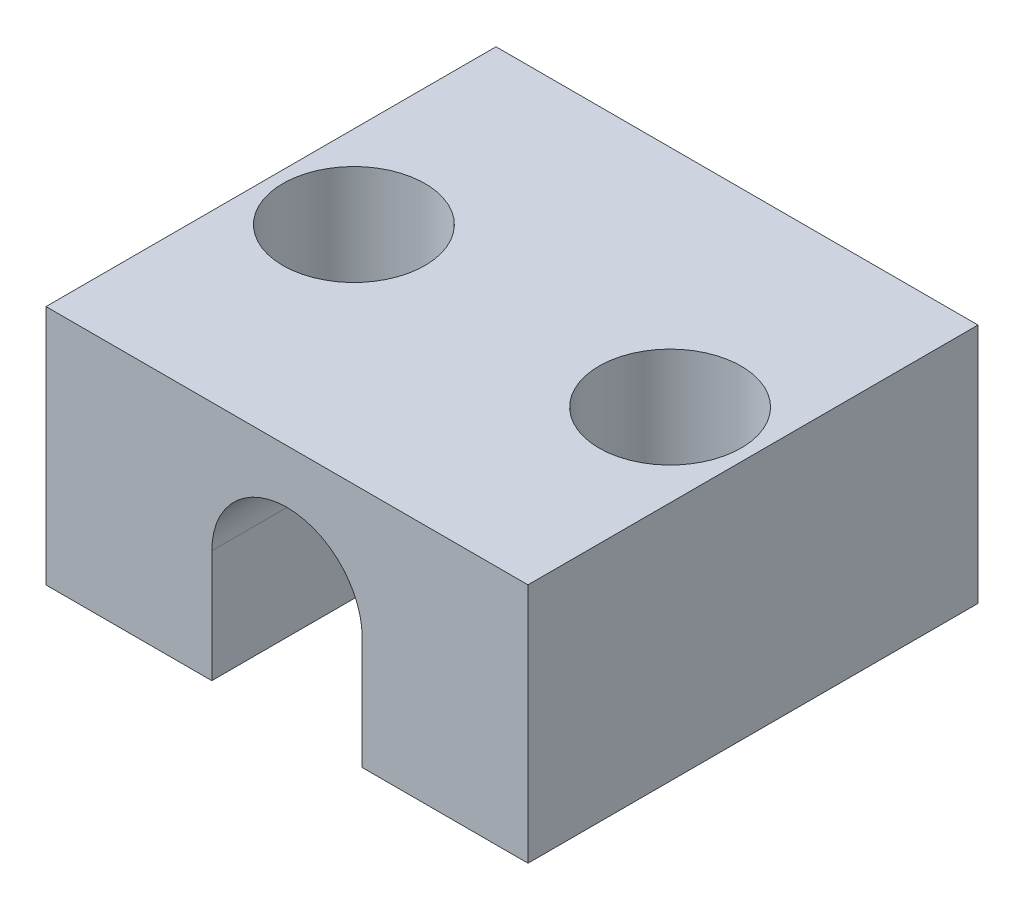
ISO-10303-21;
HEADER;
FILE_DESCRIPTION(('STEP AP214'),'2;1');
FILE_NAME('part.step','',(''),(''),'','','');
FILE_SCHEMA(('AUTOMOTIVE_DESIGN { 1 0 10303 214 1 1 1 1 }'));
ENDSEC;
DATA;
#1=APPLICATION_CONTEXT('core data for automotive mechanical design processes');
#2=APPLICATION_PROTOCOL_DEFINITION('international standard','automotive_design',2000,#1);
#3=PRODUCT_CONTEXT('',#1,'mechanical');
#4=PRODUCT('Part','Part','',(#3));
#5=PRODUCT_RELATED_PRODUCT_CATEGORY('part','',(#4));
#6=PRODUCT_DEFINITION_FORMATION('','',#4);
#7=PRODUCT_DEFINITION_CONTEXT('part definition',#1,'design');
#8=PRODUCT_DEFINITION('design','',#6,#7);
#9=PRODUCT_DEFINITION_SHAPE('','',#8);
#10=(LENGTH_UNIT() NAMED_UNIT(*) SI_UNIT(.MILLI.,.METRE.));
#11=(NAMED_UNIT(*) PLANE_ANGLE_UNIT() SI_UNIT($,.RADIAN.));
#12=(NAMED_UNIT(*) SI_UNIT($,.STERADIAN.) SOLID_ANGLE_UNIT());
#13=UNCERTAINTY_MEASURE_WITH_UNIT(LENGTH_MEASURE(1.E-05),#10,'distance_accuracy_value','');
#14=(GEOMETRIC_REPRESENTATION_CONTEXT(3) GLOBAL_UNCERTAINTY_ASSIGNED_CONTEXT((#13)) GLOBAL_UNIT_ASSIGNED_CONTEXT((#10,
#11,#12)) REPRESENTATION_CONTEXT('',''));
#15=CARTESIAN_POINT('',(0.,0.,0.));
#16=DIRECTION('',(0.,0.,1.));
#17=DIRECTION('',(1.,0.,0.));
#18=AXIS2_PLACEMENT_3D('',#15,#16,#17);
#19=CARTESIAN_POINT('',(-6.675,0.,9.5));
#20=DIRECTION('',(0.,1.,0.));
#21=DIRECTION('',(0.,0.,1.));
#22=AXIS2_PLACEMENT_3D('',#19,#20,#21);
#23=CYLINDRICAL_SURFACE('',#22,1.8);
#24=CARTESIAN_POINT('',(-6.675,0.,9.5));
#25=DIRECTION('',(0.,1.,0.));
#26=DIRECTION('',(0.,0.,1.));
#27=AXIS2_PLACEMENT_3D('',#24,#25,#26);
#28=CIRCLE('',#27,1.8);
#29=CARTESIAN_POINT('',(-6.675,0.,11.3));
#30=VERTEX_POINT('',#29);
#31=EDGE_CURVE('E149',#30,#30,#28,.T.);
#32=ORIENTED_EDGE('',*,*,#31,.F.);
#33=EDGE_LOOP('',(#32));
#34=FACE_BOUND('',#33,.T.);
#35=CARTESIAN_POINT('',(-6.675,3.,9.5));
#36=DIRECTION('',(0.,1.,0.));
#37=DIRECTION('',(0.,0.,1.));
#38=AXIS2_PLACEMENT_3D('',#35,#36,#37);
#39=CIRCLE('',#38,1.8);
#40=CARTESIAN_POINT('',(-6.675,3.,11.3));
#41=VERTEX_POINT('',#40);
#42=EDGE_CURVE('E223',#41,#41,#39,.F.);
#43=ORIENTED_EDGE('',*,*,#42,.F.);
#44=EDGE_LOOP('',(#43));
#45=FACE_BOUND('',#44,.T.);
#46=ADVANCED_FACE('F41',(#34,#45),#23,.F.);
#47=CARTESIAN_POINT('',(6.675,0.,9.5));
#48=DIRECTION('',(0.,1.,0.));
#49=DIRECTION('',(0.,0.,1.));
#50=AXIS2_PLACEMENT_3D('',#47,#48,#49);
#51=CYLINDRICAL_SURFACE('',#50,1.8);
#52=CARTESIAN_POINT('',(6.675,0.,9.5));
#53=DIRECTION('',(0.,1.,0.));
#54=DIRECTION('',(0.,0.,1.));
#55=AXIS2_PLACEMENT_3D('',#52,#53,#54);
#56=CIRCLE('',#55,1.8);
#57=CARTESIAN_POINT('',(6.675,0.,11.3));
#58=VERTEX_POINT('',#57);
#59=EDGE_CURVE('E212',#58,#58,#56,.T.);
#60=ORIENTED_EDGE('',*,*,#59,.F.);
#61=EDGE_LOOP('',(#60));
#62=FACE_BOUND('',#61,.T.);
#63=CARTESIAN_POINT('',(6.675,3.,9.5));
#64=DIRECTION('',(0.,1.,0.));
#65=DIRECTION('',(0.,0.,1.));
#66=AXIS2_PLACEMENT_3D('',#63,#64,#65);
#67=CIRCLE('',#66,1.8);
#68=CARTESIAN_POINT('',(6.675,3.,11.3));
#69=VERTEX_POINT('',#68);
#70=EDGE_CURVE('E45',#69,#69,#67,.F.);
#71=ORIENTED_EDGE('',*,*,#70,.F.);
#72=EDGE_LOOP('',(#71));
#73=FACE_BOUND('',#72,.T.);
#74=ADVANCED_FACE('F263',(#62,#73),#51,.F.);
#75=CARTESIAN_POINT('',(0.,4.75,19.));
#76=DIRECTION('',(0.,0.,-1.));
#77=DIRECTION('',(-1.,0.,0.));
#78=AXIS2_PLACEMENT_3D('',#75,#76,#77);
#79=CYLINDRICAL_SURFACE('',#78,3.175);
#80=CARTESIAN_POINT('',(0.,4.75,0.));
#81=DIRECTION('',(0.,0.,-1.));
#82=DIRECTION('',(-1.,0.,0.));
#83=AXIS2_PLACEMENT_3D('',#80,#81,#82);
#84=CIRCLE('',#83,3.175);
#85=CARTESIAN_POINT('',(-3.175,4.75,0.));
#86=VERTEX_POINT('',#85);
#87=CARTESIAN_POINT('',(3.175,4.75,0.));
#88=VERTEX_POINT('',#87);
#89=EDGE_CURVE('E144',#86,#88,#84,.T.);
#90=ORIENTED_EDGE('',*,*,#89,.T.);
#91=DIRECTION('',(0.,0.,-1.));
#92=VECTOR('',#91,1.);
#93=CARTESIAN_POINT('',(3.175,4.75,19.));
#94=LINE('',#93,#92);
#95=CARTESIAN_POINT('',(3.175,4.75,19.));
#96=VERTEX_POINT('',#95);
#97=EDGE_CURVE('E12',#96,#88,#94,.T.);
#98=ORIENTED_EDGE('',*,*,#97,.F.);
#99=CARTESIAN_POINT('',(0.,4.75,19.));
#100=DIRECTION('',(0.,0.,-1.));
#101=DIRECTION('',(-1.,0.,0.));
#102=AXIS2_PLACEMENT_3D('',#99,#100,#101);
#103=CIRCLE('',#102,3.175);
#104=CARTESIAN_POINT('',(-3.175,4.75,19.));
#105=VERTEX_POINT('',#104);
#106=EDGE_CURVE('E167',#105,#96,#103,.T.);
#107=ORIENTED_EDGE('',*,*,#106,.F.);
#108=DIRECTION('',(0.,0.,-1.));
#109=VECTOR('',#108,1.);
#110=CARTESIAN_POINT('',(-3.175,4.75,19.));
#111=LINE('',#110,#109);
#112=EDGE_CURVE('E140',#105,#86,#111,.T.);
#113=ORIENTED_EDGE('',*,*,#112,.T.);
#114=EDGE_LOOP('',(#90,#98,#107,#113));
#115=FACE_BOUND('',#114,.T.);
#116=ADVANCED_FACE('F43',(#115),#79,.F.);
#117=CARTESIAN_POINT('',(3.175,4.75,19.));
#118=DIRECTION('',(1.,0.,0.));
#119=DIRECTION('',(0.,1.,0.));
#120=AXIS2_PLACEMENT_3D('',#117,#118,#119);
#121=PLANE('',#120);
#122=DIRECTION('',(0.,-1.,0.));
#123=VECTOR('',#122,1.);
#124=CARTESIAN_POINT('',(3.175,4.75,0.));
#125=LINE('',#124,#123);
#126=CARTESIAN_POINT('',(3.175,0.,0.));
#127=VERTEX_POINT('',#126);
#128=EDGE_CURVE('E148',#88,#127,#125,.T.);
#129=ORIENTED_EDGE('',*,*,#128,.T.);
#130=DIRECTION('',(0.,0.,-1.));
#131=VECTOR('',#130,1.);
#132=CARTESIAN_POINT('',(3.175,0.,19.));
#133=LINE('',#132,#131);
#134=CARTESIAN_POINT('',(3.175,0.,19.));
#135=VERTEX_POINT('',#134);
#136=EDGE_CURVE('E52',#135,#127,#133,.T.);
#137=ORIENTED_EDGE('',*,*,#136,.F.);
#138=DIRECTION('',(0.,-1.,0.));
#139=VECTOR('',#138,1.);
#140=CARTESIAN_POINT('',(3.175,4.75,19.));
#141=LINE('',#140,#139);
#142=EDGE_CURVE('E103',#96,#135,#141,.T.);
#143=ORIENTED_EDGE('',*,*,#142,.F.);
#144=ORIENTED_EDGE('',*,*,#97,.T.);
#145=EDGE_LOOP('',(#129,#137,#143,#144));
#146=FACE_BOUND('',#145,.T.);
#147=ADVANCED_FACE('F289',(#146),#121,.F.);
#148=CARTESIAN_POINT('',(3.175,0.,19.));
#149=DIRECTION('',(0.,1.,0.));
#150=DIRECTION('',(0.,0.,1.));
#151=AXIS2_PLACEMENT_3D('',#148,#149,#150);
#152=PLANE('',#151);
#153=ORIENTED_EDGE('',*,*,#59,.T.);
#154=EDGE_LOOP('',(#153));
#155=FACE_BOUND('',#154,.T.);
#156=DIRECTION('',(1.,0.,0.));
#157=VECTOR('',#156,1.);
#158=CARTESIAN_POINT('',(3.175,0.,0.));
#159=LINE('',#158,#157);
#160=CARTESIAN_POINT('',(10.175,0.,0.));
#161=VERTEX_POINT('',#160);
#162=EDGE_CURVE('E152',#127,#161,#159,.T.);
#163=ORIENTED_EDGE('',*,*,#162,.T.);
#164=DIRECTION('',(0.,0.,-1.));
#165=VECTOR('',#164,1.);
#166=CARTESIAN_POINT('',(10.175,0.,19.));
#167=LINE('',#166,#165);
#168=CARTESIAN_POINT('',(10.175,0.,19.));
#169=VERTEX_POINT('',#168);
#170=EDGE_CURVE('E178',#169,#161,#167,.T.);
#171=ORIENTED_EDGE('',*,*,#170,.F.);
#172=DIRECTION('',(1.,0.,0.));
#173=VECTOR('',#172,1.);
#174=CARTESIAN_POINT('',(3.175,0.,19.));
#175=LINE('',#174,#173);
#176=EDGE_CURVE('E189',#135,#169,#175,.T.);
#177=ORIENTED_EDGE('',*,*,#176,.F.);
#178=ORIENTED_EDGE('',*,*,#136,.T.);
#179=EDGE_LOOP('',(#163,#171,#177,#178));
#180=FACE_BOUND('',#179,.T.);
#181=ADVANCED_FACE('F187',(#155,#180),#152,.F.);
#182=CARTESIAN_POINT('',(10.175,10.18,19.));
#183=DIRECTION('',(-1.,0.,0.));
#184=DIRECTION('',(0.,0.,1.));
#185=AXIS2_PLACEMENT_3D('',#182,#183,#184);
#186=PLANE('',#185);
#187=DIRECTION('',(0.,1.,0.));
#188=VECTOR('',#187,1.);
#189=CARTESIAN_POINT('',(10.175,10.18,0.));
#190=LINE('',#189,#188);
#191=CARTESIAN_POINT('',(10.175,10.18,0.));
#192=VERTEX_POINT('',#191);
#193=EDGE_CURVE('E155',#161,#192,#190,.T.);
#194=ORIENTED_EDGE('',*,*,#193,.T.);
#195=DIRECTION('',(0.,0.,-1.));
#196=VECTOR('',#195,1.);
#197=CARTESIAN_POINT('',(10.175,10.18,19.));
#198=LINE('',#197,#196);
#199=CARTESIAN_POINT('',(10.175,10.18,19.));
#200=VERTEX_POINT('',#199);
#201=EDGE_CURVE('E174',#200,#192,#198,.T.);
#202=ORIENTED_EDGE('',*,*,#201,.F.);
#203=DIRECTION('',(0.,1.,0.));
#204=VECTOR('',#203,1.);
#205=CARTESIAN_POINT('',(10.175,10.18,19.));
#206=LINE('',#205,#204);
#207=EDGE_CURVE('E202',#169,#200,#206,.T.);
#208=ORIENTED_EDGE('',*,*,#207,.F.);
#209=ORIENTED_EDGE('',*,*,#170,.T.);
#210=EDGE_LOOP('',(#194,#202,#208,#209));
#211=FACE_BOUND('',#210,.T.);
#212=ADVANCED_FACE('F197',(#211),#186,.F.);
#213=CARTESIAN_POINT('',(-10.175,10.18,19.));
#214=DIRECTION('',(0.,-1.,0.));
#215=DIRECTION('',(0.,0.,-1.));
#216=AXIS2_PLACEMENT_3D('',#213,#214,#215);
#217=PLANE('',#216);
#218=CARTESIAN_POINT('',(-6.675,10.18,9.5));
#219=DIRECTION('',(0.,1.,0.));
#220=DIRECTION('',(0.,0.,1.));
#221=AXIS2_PLACEMENT_3D('',#218,#219,#220);
#222=CIRCLE('',#221,3.);
#223=CARTESIAN_POINT('',(-6.675,10.18,12.5));
#224=VERTEX_POINT('',#223);
#225=EDGE_CURVE('E232',#224,#224,#222,.T.);
#226=ORIENTED_EDGE('',*,*,#225,.F.);
#227=EDGE_LOOP('',(#226));
#228=FACE_BOUND('',#227,.T.);
#229=CARTESIAN_POINT('',(6.675,10.18,9.5));
#230=DIRECTION('',(0.,1.,0.));
#231=DIRECTION('',(0.,0.,1.));
#232=AXIS2_PLACEMENT_3D('',#229,#230,#231);
#233=CIRCLE('',#232,3.);
#234=CARTESIAN_POINT('',(6.675,10.18,12.5));
#235=VERTEX_POINT('',#234);
#236=EDGE_CURVE('E219',#235,#235,#233,.T.);
#237=ORIENTED_EDGE('',*,*,#236,.F.);
#238=EDGE_LOOP('',(#237));
#239=FACE_BOUND('',#238,.T.);
#240=DIRECTION('',(-1.,0.,0.));
#241=VECTOR('',#240,1.);
#242=CARTESIAN_POINT('',(-10.175,10.18,0.));
#243=LINE('',#242,#241);
#244=CARTESIAN_POINT('',(-10.175,10.18,0.));
#245=VERTEX_POINT('',#244);
#246=EDGE_CURVE('E158',#192,#245,#243,.T.);
#247=ORIENTED_EDGE('',*,*,#246,.T.);
#248=DIRECTION('',(0.,0.,-1.));
#249=VECTOR('',#248,1.);
#250=CARTESIAN_POINT('',(-10.175,10.18,19.));
#251=LINE('',#250,#249);
#252=CARTESIAN_POINT('',(-10.175,10.18,19.));
#253=VERTEX_POINT('',#252);
#254=EDGE_CURVE('E133',#253,#245,#251,.T.);
#255=ORIENTED_EDGE('',*,*,#254,.F.);
#256=DIRECTION('',(-1.,0.,0.));
#257=VECTOR('',#256,1.);
#258=CARTESIAN_POINT('',(-10.175,10.18,19.));
#259=LINE('',#258,#257);
#260=EDGE_CURVE('E122',#200,#253,#259,.T.);
#261=ORIENTED_EDGE('',*,*,#260,.F.);
#262=ORIENTED_EDGE('',*,*,#201,.T.);
#263=EDGE_LOOP('',(#247,#255,#261,#262));
#264=FACE_BOUND('',#263,.T.);
#265=ADVANCED_FACE('F200',(#228,#239,#264),#217,.F.);
#266=CARTESIAN_POINT('',(-10.175,0.,19.));
#267=DIRECTION('',(1.,0.,0.));
#268=DIRECTION('',(0.,0.,-1.));
#269=AXIS2_PLACEMENT_3D('',#266,#267,#268);
#270=PLANE('',#269);
#271=DIRECTION('',(0.,-1.,0.));
#272=VECTOR('',#271,1.);
#273=CARTESIAN_POINT('',(-10.175,0.,0.));
#274=LINE('',#273,#272);
#275=CARTESIAN_POINT('',(-10.175,0.,0.));
#276=VERTEX_POINT('',#275);
#277=EDGE_CURVE('E131',#245,#276,#274,.T.);
#278=ORIENTED_EDGE('',*,*,#277,.T.);
#279=DIRECTION('',(0.,0.,-1.));
#280=VECTOR('',#279,1.);
#281=CARTESIAN_POINT('',(-10.175,0.,19.));
#282=LINE('',#281,#280);
#283=CARTESIAN_POINT('',(-10.175,0.,19.));
#284=VERTEX_POINT('',#283);
#285=EDGE_CURVE('E128',#284,#276,#282,.T.);
#286=ORIENTED_EDGE('',*,*,#285,.F.);
#287=DIRECTION('',(0.,-1.,0.));
#288=VECTOR('',#287,1.);
#289=CARTESIAN_POINT('',(-10.175,0.,19.));
#290=LINE('',#289,#288);
#291=EDGE_CURVE('E116',#253,#284,#290,.T.);
#292=ORIENTED_EDGE('',*,*,#291,.F.);
#293=ORIENTED_EDGE('',*,*,#254,.T.);
#294=EDGE_LOOP('',(#278,#286,#292,#293));
#295=FACE_BOUND('',#294,.T.);
#296=ADVANCED_FACE('F129',(#295),#270,.F.);
#297=CARTESIAN_POINT('',(-10.175,0.,19.));
#298=DIRECTION('',(0.,1.,0.));
#299=DIRECTION('',(0.,0.,1.));
#300=AXIS2_PLACEMENT_3D('',#297,#298,#299);
#301=PLANE('',#300);
#302=ORIENTED_EDGE('',*,*,#31,.T.);
#303=EDGE_LOOP('',(#302));
#304=FACE_BOUND('',#303,.T.);
#305=DIRECTION('',(1.,0.,0.));
#306=VECTOR('',#305,1.);
#307=CARTESIAN_POINT('',(-10.175,0.,0.));
#308=LINE('',#307,#306);
#309=CARTESIAN_POINT('',(-3.175,0.,0.));
#310=VERTEX_POINT('',#309);
#311=EDGE_CURVE('E89',#276,#310,#308,.T.);
#312=ORIENTED_EDGE('',*,*,#311,.T.);
#313=DIRECTION('',(0.,0.,-1.));
#314=VECTOR('',#313,1.);
#315=CARTESIAN_POINT('',(-3.175,0.,19.));
#316=LINE('',#315,#314);
#317=CARTESIAN_POINT('',(-3.175,0.,19.));
#318=VERTEX_POINT('',#317);
#319=EDGE_CURVE('E134',#318,#310,#316,.T.);
#320=ORIENTED_EDGE('',*,*,#319,.F.);
#321=DIRECTION('',(1.,0.,0.));
#322=VECTOR('',#321,1.);
#323=CARTESIAN_POINT('',(-10.175,0.,19.));
#324=LINE('',#323,#322);
#325=EDGE_CURVE('E120',#284,#318,#324,.T.);
#326=ORIENTED_EDGE('',*,*,#325,.F.);
#327=ORIENTED_EDGE('',*,*,#285,.T.);
#328=EDGE_LOOP('',(#312,#320,#326,#327));
#329=FACE_BOUND('',#328,.T.);
#330=ADVANCED_FACE('F136',(#304,#329),#301,.F.);
#331=CARTESIAN_POINT('',(-3.175,0.,19.));
#332=DIRECTION('',(-1.,0.,0.));
#333=DIRECTION('',(0.,0.,1.));
#334=AXIS2_PLACEMENT_3D('',#331,#332,#333);
#335=PLANE('',#334);
#336=DIRECTION('',(0.,1.,0.));
#337=VECTOR('',#336,1.);
#338=CARTESIAN_POINT('',(-3.175,0.,0.));
#339=LINE('',#338,#337);
#340=EDGE_CURVE('E95',#310,#86,#339,.T.);
#341=ORIENTED_EDGE('',*,*,#340,.T.);
#342=ORIENTED_EDGE('',*,*,#112,.F.);
#343=DIRECTION('',(0.,1.,0.));
#344=VECTOR('',#343,1.);
#345=CARTESIAN_POINT('',(-3.175,0.,19.));
#346=LINE('',#345,#344);
#347=EDGE_CURVE('E60',#318,#105,#346,.T.);
#348=ORIENTED_EDGE('',*,*,#347,.F.);
#349=ORIENTED_EDGE('',*,*,#319,.T.);
#350=EDGE_LOOP('',(#341,#342,#348,#349));
#351=FACE_BOUND('',#350,.T.);
#352=ADVANCED_FACE('F276',(#351),#335,.F.);
#353=CARTESIAN_POINT('',(0.,4.75,19.));
#354=DIRECTION('',(0.,0.,-1.));
#355=DIRECTION('',(-1.,0.,0.));
#356=AXIS2_PLACEMENT_3D('',#353,#354,#355);
#357=PLANE('',#356);
#358=ORIENTED_EDGE('',*,*,#106,.T.);
#359=ORIENTED_EDGE('',*,*,#142,.T.);
#360=ORIENTED_EDGE('',*,*,#176,.T.);
#361=ORIENTED_EDGE('',*,*,#207,.T.);
#362=ORIENTED_EDGE('',*,*,#260,.T.);
#363=ORIENTED_EDGE('',*,*,#291,.T.);
#364=ORIENTED_EDGE('',*,*,#325,.T.);
#365=ORIENTED_EDGE('',*,*,#347,.T.);
#366=EDGE_LOOP('',(#358,#359,#360,#361,#362,#363,#364,#365));
#367=FACE_BOUND('',#366,.T.);
#368=ADVANCED_FACE('F118',(#367),#357,.F.);
#369=CARTESIAN_POINT('',(0.,4.75,0.));
#370=DIRECTION('',(0.,0.,-1.));
#371=DIRECTION('',(-1.,0.,0.));
#372=AXIS2_PLACEMENT_3D('',#369,#370,#371);
#373=PLANE('',#372);
#374=ORIENTED_EDGE('',*,*,#89,.F.);
#375=ORIENTED_EDGE('',*,*,#340,.F.);
#376=ORIENTED_EDGE('',*,*,#311,.F.);
#377=ORIENTED_EDGE('',*,*,#277,.F.);
#378=ORIENTED_EDGE('',*,*,#246,.F.);
#379=ORIENTED_EDGE('',*,*,#193,.F.);
#380=ORIENTED_EDGE('',*,*,#162,.F.);
#381=ORIENTED_EDGE('',*,*,#128,.F.);
#382=EDGE_LOOP('',(#374,#375,#376,#377,#378,#379,#380,#381));
#383=FACE_BOUND('',#382,.T.);
#384=ADVANCED_FACE('F193',(#383),#373,.T.);
#385=CARTESIAN_POINT('',(-10.175,3.,19.));
#386=DIRECTION('',(0.,1.,0.));
#387=DIRECTION('',(0.,0.,1.));
#388=AXIS2_PLACEMENT_3D('',#385,#386,#387);
#389=PLANE('',#388);
#390=CARTESIAN_POINT('',(6.675,3.,9.5));
#391=DIRECTION('',(0.,1.,0.));
#392=DIRECTION('',(0.,0.,1.));
#393=AXIS2_PLACEMENT_3D('',#390,#391,#392);
#394=CIRCLE('',#393,3.);
#395=CARTESIAN_POINT('',(6.675,3.,12.5));
#396=VERTEX_POINT('',#395);
#397=EDGE_CURVE('E224',#396,#396,#394,.F.);
#398=ORIENTED_EDGE('',*,*,#397,.F.);
#399=EDGE_LOOP('',(#398));
#400=FACE_BOUND('',#399,.T.);
#401=ORIENTED_EDGE('',*,*,#70,.T.);
#402=EDGE_LOOP('',(#401));
#403=FACE_BOUND('',#402,.T.);
#404=ADVANCED_FACE('F249',(#400,#403),#389,.T.);
#405=CARTESIAN_POINT('',(6.675,-8.48528137423857,9.5));
#406=DIRECTION('',(0.,1.,0.));
#407=DIRECTION('',(0.,0.,1.));
#408=AXIS2_PLACEMENT_3D('',#405,#406,#407);
#409=CYLINDRICAL_SURFACE('',#408,3.);
#410=ORIENTED_EDGE('',*,*,#397,.T.);
#411=EDGE_LOOP('',(#410));
#412=FACE_BOUND('',#411,.T.);
#413=ORIENTED_EDGE('',*,*,#236,.T.);
#414=EDGE_LOOP('',(#413));
#415=FACE_BOUND('',#414,.T.);
#416=ADVANCED_FACE('F247',(#412,#415),#409,.F.);
#417=CARTESIAN_POINT('',(-6.675,-8.48528137423857,9.5));
#418=DIRECTION('',(0.,1.,0.));
#419=DIRECTION('',(0.,0.,1.));
#420=AXIS2_PLACEMENT_3D('',#417,#418,#419);
#421=CYLINDRICAL_SURFACE('',#420,3.);
#422=CARTESIAN_POINT('',(-6.675,3.,9.5));
#423=DIRECTION('',(0.,1.,0.));
#424=DIRECTION('',(0.,0.,1.));
#425=AXIS2_PLACEMENT_3D('',#422,#423,#424);
#426=CIRCLE('',#425,3.);
#427=CARTESIAN_POINT('',(-6.675,3.,12.5));
#428=VERTEX_POINT('',#427);
#429=EDGE_CURVE('E228',#428,#428,#426,.F.);
#430=ORIENTED_EDGE('',*,*,#429,.T.);
#431=EDGE_LOOP('',(#430));
#432=FACE_BOUND('',#431,.T.);
#433=ORIENTED_EDGE('',*,*,#225,.T.);
#434=EDGE_LOOP('',(#433));
#435=FACE_BOUND('',#434,.T.);
#436=ADVANCED_FACE('F240',(#432,#435),#421,.F.);
#437=CARTESIAN_POINT('',(-10.175,3.,19.));
#438=DIRECTION('',(0.,1.,0.));
#439=DIRECTION('',(0.,0.,1.));
#440=AXIS2_PLACEMENT_3D('',#437,#438,#439);
#441=PLANE('',#440);
#442=ORIENTED_EDGE('',*,*,#429,.F.);
#443=EDGE_LOOP('',(#442));
#444=FACE_BOUND('',#443,.T.);
#445=ORIENTED_EDGE('',*,*,#42,.T.);
#446=EDGE_LOOP('',(#445));
#447=FACE_BOUND('',#446,.T.);
#448=ADVANCED_FACE('F256',(#444,#447),#441,.T.);
#449=CLOSED_SHELL('',(#46,#74,#116,#147,#181,#212,#265,#296,#330,#352,#368,#384,#404,#416,#436,#448));
#450=MANIFOLD_SOLID_BREP('B2',#449);
#451=ADVANCED_BREP_SHAPE_REPRESENTATION('',(#18,#450),#14);
#452=SHAPE_DEFINITION_REPRESENTATION(#9,#451);
ENDSEC;
END-ISO-10303-21;
